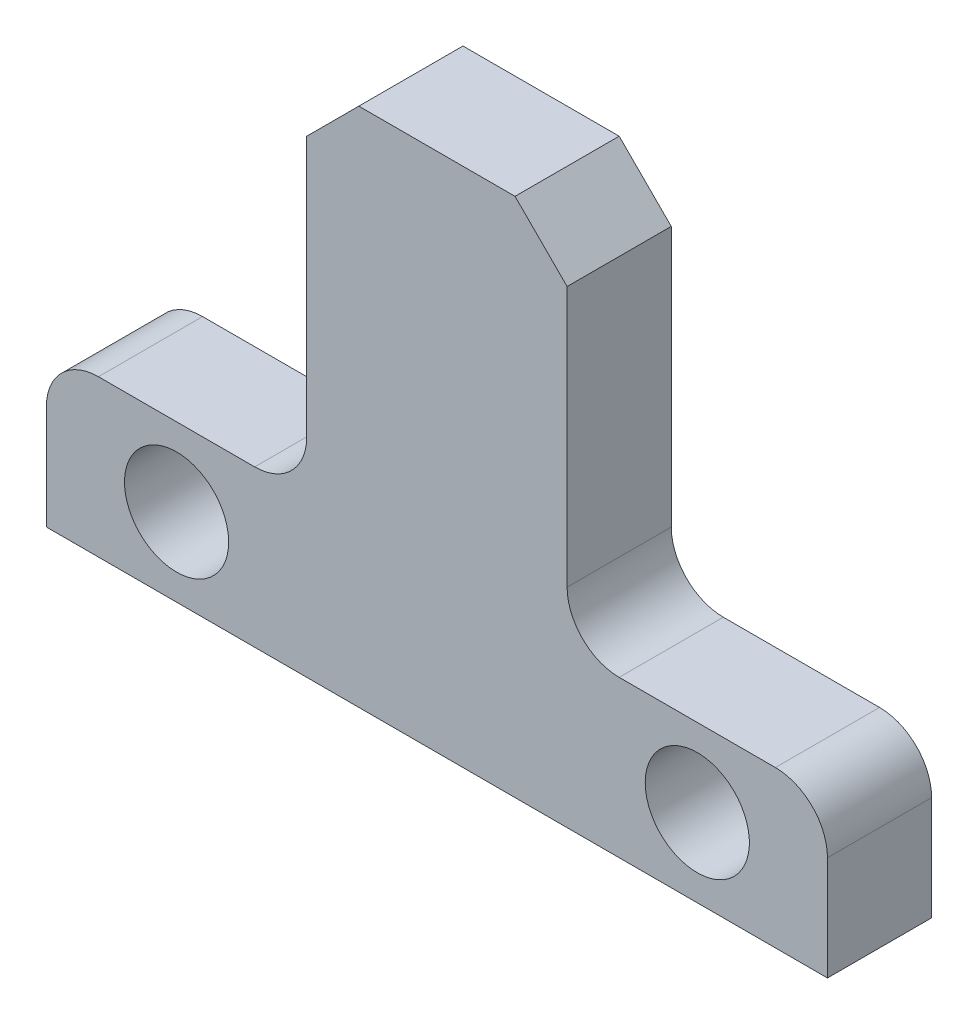
ISO-10303-21;
HEADER;
FILE_DESCRIPTION(('STEP AP214'),'2;1');
FILE_NAME('part.step','',(''),(''),'','','');
FILE_SCHEMA(('AUTOMOTIVE_DESIGN { 1 0 10303 214 1 1 1 1 }'));
ENDSEC;
DATA;
#1=APPLICATION_CONTEXT('core data for automotive mechanical design processes');
#2=APPLICATION_PROTOCOL_DEFINITION('international standard','automotive_design',2000,#1);
#3=PRODUCT_CONTEXT('',#1,'mechanical');
#4=PRODUCT('Part','Part','',(#3));
#5=PRODUCT_RELATED_PRODUCT_CATEGORY('part','',(#4));
#6=PRODUCT_DEFINITION_FORMATION('','',#4);
#7=PRODUCT_DEFINITION_CONTEXT('part definition',#1,'design');
#8=PRODUCT_DEFINITION('design','',#6,#7);
#9=PRODUCT_DEFINITION_SHAPE('','',#8);
#10=(LENGTH_UNIT() NAMED_UNIT(*) SI_UNIT(.MILLI.,.METRE.));
#11=(NAMED_UNIT(*) PLANE_ANGLE_UNIT() SI_UNIT($,.RADIAN.));
#12=(NAMED_UNIT(*) SI_UNIT($,.STERADIAN.) SOLID_ANGLE_UNIT());
#13=UNCERTAINTY_MEASURE_WITH_UNIT(LENGTH_MEASURE(1.E-05),#10,'distance_accuracy_value','');
#14=(GEOMETRIC_REPRESENTATION_CONTEXT(3) GLOBAL_UNCERTAINTY_ASSIGNED_CONTEXT((#13)) GLOBAL_UNIT_ASSIGNED_CONTEXT((#10,
#11,#12)) REPRESENTATION_CONTEXT('',''));
#15=CARTESIAN_POINT('',(0.,0.,0.));
#16=DIRECTION('',(0.,0.,1.));
#17=DIRECTION('',(1.,0.,0.));
#18=AXIS2_PLACEMENT_3D('',#15,#16,#17);
#19=CARTESIAN_POINT('',(-65.,20.,20.));
#20=DIRECTION('',(0.,0.,1.));
#21=DIRECTION('',(1.,0.,0.));
#22=AXIS2_PLACEMENT_3D('',#19,#20,#21);
#23=PLANE('',#22);
#24=CARTESIAN_POINT('',(50.,15.,20.));
#25=DIRECTION('',(0.,0.,1.));
#26=DIRECTION('',(-1.,0.,0.));
#27=AXIS2_PLACEMENT_3D('',#24,#25,#26);
#28=CIRCLE('',#27,10.);
#29=CARTESIAN_POINT('',(40.,15.,20.));
#30=VERTEX_POINT('',#29);
#31=EDGE_CURVE('E186',#30,#30,#28,.T.);
#32=ORIENTED_EDGE('',*,*,#31,.F.);
#33=EDGE_LOOP('',(#32));
#34=FACE_BOUND('',#33,.T.);
#35=DIRECTION('',(0.,-1.,0.));
#36=VECTOR('',#35,1.);
#37=CARTESIAN_POINT('',(-75.,0.,20.));
#38=LINE('',#37,#36);
#39=CARTESIAN_POINT('',(-75.,19.9999999999999,20.));
#40=VERTEX_POINT('',#39);
#41=CARTESIAN_POINT('',(-75.,0.,20.));
#42=VERTEX_POINT('',#41);
#43=EDGE_CURVE('E222',#40,#42,#38,.T.);
#44=ORIENTED_EDGE('',*,*,#43,.T.);
#45=DIRECTION('',(1.,0.,0.));
#46=VECTOR('',#45,1.);
#47=CARTESIAN_POINT('',(-75.,0.,20.));
#48=LINE('',#47,#46);
#49=CARTESIAN_POINT('',(75.,0.,20.));
#50=VERTEX_POINT('',#49);
#51=EDGE_CURVE('E122',#42,#50,#48,.T.);
#52=ORIENTED_EDGE('',*,*,#51,.T.);
#53=DIRECTION('',(0.,1.,0.));
#54=VECTOR('',#53,1.);
#55=CARTESIAN_POINT('',(75.,0.,20.));
#56=LINE('',#55,#54);
#57=CARTESIAN_POINT('',(75.,19.9999999999999,20.));
#58=VERTEX_POINT('',#57);
#59=EDGE_CURVE('E267',#50,#58,#56,.T.);
#60=ORIENTED_EDGE('',*,*,#59,.T.);
#61=CARTESIAN_POINT('',(65.,20.,20.));
#62=DIRECTION('',(0.,0.,1.));
#63=DIRECTION('',(-1.,0.,0.));
#64=AXIS2_PLACEMENT_3D('',#61,#62,#63);
#65=CIRCLE('',#64,10.);
#66=CARTESIAN_POINT('',(64.9999999999999,30.,20.));
#67=VERTEX_POINT('',#66);
#68=EDGE_CURVE('E287',#58,#67,#65,.T.);
#69=ORIENTED_EDGE('',*,*,#68,.T.);
#70=DIRECTION('',(-1.,0.,0.));
#71=VECTOR('',#70,1.);
#72=CARTESIAN_POINT('',(64.9999999999999,30.,20.));
#73=LINE('',#72,#71);
#74=CARTESIAN_POINT('',(35.,30.,20.));
#75=VERTEX_POINT('',#74);
#76=EDGE_CURVE('E283',#67,#75,#73,.T.);
#77=ORIENTED_EDGE('',*,*,#76,.T.);
#78=CARTESIAN_POINT('',(35.,40.,20.));
#79=DIRECTION('',(0.,0.,-1.));
#80=DIRECTION('',(1.,0.,0.));
#81=AXIS2_PLACEMENT_3D('',#78,#79,#80);
#82=CIRCLE('',#81,9.99999999999999);
#83=CARTESIAN_POINT('',(25.,40.0000000000001,20.));
#84=VERTEX_POINT('',#83);
#85=EDGE_CURVE('E286',#75,#84,#82,.T.);
#86=ORIENTED_EDGE('',*,*,#85,.T.);
#87=DIRECTION('',(0.,1.,0.));
#88=VECTOR('',#87,1.);
#89=CARTESIAN_POINT('',(25.,40.0000000000001,20.));
#90=LINE('',#89,#88);
#91=CARTESIAN_POINT('',(25.,90.,20.));
#92=VERTEX_POINT('',#91);
#93=EDGE_CURVE('E291',#84,#92,#90,.T.);
#94=ORIENTED_EDGE('',*,*,#93,.T.);
#95=DIRECTION('',(-0.707106781186548,0.707106781186547,0.));
#96=VECTOR('',#95,1.);
#97=CARTESIAN_POINT('',(25.,90.,20.));
#98=LINE('',#97,#96);
#99=CARTESIAN_POINT('',(15.,100.,20.));
#100=VERTEX_POINT('',#99);
#101=EDGE_CURVE('E298',#92,#100,#98,.T.);
#102=ORIENTED_EDGE('',*,*,#101,.T.);
#103=DIRECTION('',(-1.,0.,0.));
#104=VECTOR('',#103,1.);
#105=CARTESIAN_POINT('',(-15.,100.,20.));
#106=LINE('',#105,#104);
#107=CARTESIAN_POINT('',(-15.,100.,20.));
#108=VERTEX_POINT('',#107);
#109=EDGE_CURVE('E301',#100,#108,#106,.T.);
#110=ORIENTED_EDGE('',*,*,#109,.T.);
#111=DIRECTION('',(-0.707106781186548,-0.707106781186547,0.));
#112=VECTOR('',#111,1.);
#113=CARTESIAN_POINT('',(-25.,90.,20.));
#114=LINE('',#113,#112);
#115=CARTESIAN_POINT('',(-25.,90.,20.));
#116=VERTEX_POINT('',#115);
#117=EDGE_CURVE('E304',#108,#116,#114,.T.);
#118=ORIENTED_EDGE('',*,*,#117,.T.);
#119=DIRECTION('',(0.,-1.,0.));
#120=VECTOR('',#119,1.);
#121=CARTESIAN_POINT('',(-25.,40.0000000000001,20.));
#122=LINE('',#121,#120);
#123=CARTESIAN_POINT('',(-25.,40.0000000000001,20.));
#124=VERTEX_POINT('',#123);
#125=EDGE_CURVE('E159',#116,#124,#122,.T.);
#126=ORIENTED_EDGE('',*,*,#125,.T.);
#127=CARTESIAN_POINT('',(-35.,40.,20.));
#128=DIRECTION('',(0.,0.,-1.));
#129=DIRECTION('',(-1.,0.,0.));
#130=AXIS2_PLACEMENT_3D('',#127,#128,#129);
#131=CIRCLE('',#130,9.99999999999999);
#132=CARTESIAN_POINT('',(-35.,30.,20.));
#133=VERTEX_POINT('',#132);
#134=EDGE_CURVE('E153',#124,#133,#131,.T.);
#135=ORIENTED_EDGE('',*,*,#134,.T.);
#136=DIRECTION('',(-1.,0.,0.));
#137=VECTOR('',#136,1.);
#138=CARTESIAN_POINT('',(-64.9999999999999,30.,20.));
#139=LINE('',#138,#137);
#140=CARTESIAN_POINT('',(-64.9999999999999,30.,20.));
#141=VERTEX_POINT('',#140);
#142=EDGE_CURVE('E157',#133,#141,#139,.T.);
#143=ORIENTED_EDGE('',*,*,#142,.T.);
#144=CARTESIAN_POINT('',(-65.,20.,20.));
#145=DIRECTION('',(0.,0.,1.));
#146=DIRECTION('',(1.,0.,0.));
#147=AXIS2_PLACEMENT_3D('',#144,#145,#146);
#148=CIRCLE('',#147,10.);
#149=EDGE_CURVE('E61',#141,#40,#148,.T.);
#150=ORIENTED_EDGE('',*,*,#149,.T.);
#151=EDGE_LOOP('',(#44,#52,#60,#69,#77,#86,#94,#102,#110,#118,#126,#135,#143,#150));
#152=FACE_BOUND('',#151,.T.);
#153=CARTESIAN_POINT('',(-50.,15.,20.));
#154=DIRECTION('',(0.,0.,1.));
#155=DIRECTION('',(1.,0.,0.));
#156=AXIS2_PLACEMENT_3D('',#153,#154,#155);
#157=CIRCLE('',#156,10.);
#158=CARTESIAN_POINT('',(-40.,15.,20.));
#159=VERTEX_POINT('',#158);
#160=EDGE_CURVE('E348',#159,#159,#157,.T.);
#161=ORIENTED_EDGE('',*,*,#160,.F.);
#162=EDGE_LOOP('',(#161));
#163=FACE_BOUND('',#162,.T.);
#164=ADVANCED_FACE('F43',(#34,#152,#163),#23,.T.);
#165=CARTESIAN_POINT('',(-65.,20.,0.));
#166=DIRECTION('',(0.,0.,1.));
#167=DIRECTION('',(1.,0.,0.));
#168=AXIS2_PLACEMENT_3D('',#165,#166,#167);
#169=PLANE('',#168);
#170=DIRECTION('',(0.,-1.,0.));
#171=VECTOR('',#170,1.);
#172=CARTESIAN_POINT('',(-75.,0.,0.));
#173=LINE('',#172,#171);
#174=CARTESIAN_POINT('',(-75.,19.9999999999999,0.));
#175=VERTEX_POINT('',#174);
#176=CARTESIAN_POINT('',(-75.,0.,0.));
#177=VERTEX_POINT('',#176);
#178=EDGE_CURVE('E181',#175,#177,#173,.T.);
#179=ORIENTED_EDGE('',*,*,#178,.F.);
#180=CARTESIAN_POINT('',(-65.,20.,0.));
#181=DIRECTION('',(0.,0.,1.));
#182=DIRECTION('',(1.,0.,0.));
#183=AXIS2_PLACEMENT_3D('',#180,#181,#182);
#184=CIRCLE('',#183,10.);
#185=CARTESIAN_POINT('',(-64.9999999999999,30.,0.));
#186=VERTEX_POINT('',#185);
#187=EDGE_CURVE('E114',#186,#175,#184,.T.);
#188=ORIENTED_EDGE('',*,*,#187,.F.);
#189=DIRECTION('',(-1.,0.,0.));
#190=VECTOR('',#189,1.);
#191=CARTESIAN_POINT('',(-64.9999999999999,30.,0.));
#192=LINE('',#191,#190);
#193=CARTESIAN_POINT('',(-35.,30.,0.));
#194=VERTEX_POINT('',#193);
#195=EDGE_CURVE('E108',#194,#186,#192,.T.);
#196=ORIENTED_EDGE('',*,*,#195,.F.);
#197=CARTESIAN_POINT('',(-35.,40.,0.));
#198=DIRECTION('',(0.,0.,-1.));
#199=DIRECTION('',(-1.,0.,0.));
#200=AXIS2_PLACEMENT_3D('',#197,#198,#199);
#201=CIRCLE('',#200,9.99999999999999);
#202=CARTESIAN_POINT('',(-25.,40.0000000000001,0.));
#203=VERTEX_POINT('',#202);
#204=EDGE_CURVE('E168',#203,#194,#201,.T.);
#205=ORIENTED_EDGE('',*,*,#204,.F.);
#206=DIRECTION('',(0.,-1.,0.));
#207=VECTOR('',#206,1.);
#208=CARTESIAN_POINT('',(-25.,40.0000000000001,0.));
#209=LINE('',#208,#207);
#210=CARTESIAN_POINT('',(-25.,90.,0.));
#211=VERTEX_POINT('',#210);
#212=EDGE_CURVE('E213',#211,#203,#209,.T.);
#213=ORIENTED_EDGE('',*,*,#212,.F.);
#214=DIRECTION('',(-0.707106781186548,-0.707106781186547,0.));
#215=VECTOR('',#214,1.);
#216=CARTESIAN_POINT('',(-25.,90.,0.));
#217=LINE('',#216,#215);
#218=CARTESIAN_POINT('',(-15.,100.,0.));
#219=VERTEX_POINT('',#218);
#220=EDGE_CURVE('E210',#219,#211,#217,.T.);
#221=ORIENTED_EDGE('',*,*,#220,.F.);
#222=DIRECTION('',(-1.,0.,0.));
#223=VECTOR('',#222,1.);
#224=CARTESIAN_POINT('',(-15.,100.,0.));
#225=LINE('',#224,#223);
#226=CARTESIAN_POINT('',(15.,100.,0.));
#227=VERTEX_POINT('',#226);
#228=EDGE_CURVE('E207',#227,#219,#225,.T.);
#229=ORIENTED_EDGE('',*,*,#228,.F.);
#230=DIRECTION('',(-0.707106781186548,0.707106781186547,0.));
#231=VECTOR('',#230,1.);
#232=CARTESIAN_POINT('',(25.,90.,0.));
#233=LINE('',#232,#231);
#234=CARTESIAN_POINT('',(25.,90.,0.));
#235=VERTEX_POINT('',#234);
#236=EDGE_CURVE('E204',#235,#227,#233,.T.);
#237=ORIENTED_EDGE('',*,*,#236,.F.);
#238=DIRECTION('',(0.,1.,0.));
#239=VECTOR('',#238,1.);
#240=CARTESIAN_POINT('',(25.,40.0000000000001,0.));
#241=LINE('',#240,#239);
#242=CARTESIAN_POINT('',(25.,40.0000000000001,0.));
#243=VERTEX_POINT('',#242);
#244=EDGE_CURVE('E201',#243,#235,#241,.T.);
#245=ORIENTED_EDGE('',*,*,#244,.F.);
#246=CARTESIAN_POINT('',(35.,40.,0.));
#247=DIRECTION('',(0.,0.,-1.));
#248=DIRECTION('',(1.,0.,0.));
#249=AXIS2_PLACEMENT_3D('',#246,#247,#248);
#250=CIRCLE('',#249,9.99999999999999);
#251=CARTESIAN_POINT('',(35.,30.,0.));
#252=VERTEX_POINT('',#251);
#253=EDGE_CURVE('E198',#252,#243,#250,.T.);
#254=ORIENTED_EDGE('',*,*,#253,.F.);
#255=DIRECTION('',(-1.,0.,0.));
#256=VECTOR('',#255,1.);
#257=CARTESIAN_POINT('',(64.9999999999999,30.,0.));
#258=LINE('',#257,#256);
#259=CARTESIAN_POINT('',(64.9999999999999,30.,0.));
#260=VERTEX_POINT('',#259);
#261=EDGE_CURVE('E195',#260,#252,#258,.T.);
#262=ORIENTED_EDGE('',*,*,#261,.F.);
#263=CARTESIAN_POINT('',(65.,20.,0.));
#264=DIRECTION('',(0.,0.,1.));
#265=DIRECTION('',(-1.,0.,0.));
#266=AXIS2_PLACEMENT_3D('',#263,#264,#265);
#267=CIRCLE('',#266,10.);
#268=CARTESIAN_POINT('',(75.,19.9999999999999,0.));
#269=VERTEX_POINT('',#268);
#270=EDGE_CURVE('E192',#269,#260,#267,.T.);
#271=ORIENTED_EDGE('',*,*,#270,.F.);
#272=DIRECTION('',(0.,1.,0.));
#273=VECTOR('',#272,1.);
#274=CARTESIAN_POINT('',(75.,0.,0.));
#275=LINE('',#274,#273);
#276=CARTESIAN_POINT('',(75.,0.,0.));
#277=VERTEX_POINT('',#276);
#278=EDGE_CURVE('E189',#277,#269,#275,.T.);
#279=ORIENTED_EDGE('',*,*,#278,.F.);
#280=DIRECTION('',(1.,0.,0.));
#281=VECTOR('',#280,1.);
#282=CARTESIAN_POINT('',(-75.,0.,0.));
#283=LINE('',#282,#281);
#284=EDGE_CURVE('E185',#177,#277,#283,.T.);
#285=ORIENTED_EDGE('',*,*,#284,.F.);
#286=EDGE_LOOP('',(#179,#188,#196,#205,#213,#221,#229,#237,#245,#254,#262,#271,#279,#285));
#287=FACE_BOUND('',#286,.T.);
#288=CARTESIAN_POINT('',(50.,15.,0.));
#289=DIRECTION('',(0.,0.,1.));
#290=DIRECTION('',(-1.,0.,0.));
#291=AXIS2_PLACEMENT_3D('',#288,#289,#290);
#292=CIRCLE('',#291,10.);
#293=CARTESIAN_POINT('',(40.,15.,0.));
#294=VERTEX_POINT('',#293);
#295=EDGE_CURVE('E356',#294,#294,#292,.T.);
#296=ORIENTED_EDGE('',*,*,#295,.T.);
#297=EDGE_LOOP('',(#296));
#298=FACE_BOUND('',#297,.T.);
#299=CARTESIAN_POINT('',(-50.,15.,0.));
#300=DIRECTION('',(0.,0.,1.));
#301=DIRECTION('',(1.,0.,0.));
#302=AXIS2_PLACEMENT_3D('',#299,#300,#301);
#303=CIRCLE('',#302,10.);
#304=CARTESIAN_POINT('',(-40.,15.,0.));
#305=VERTEX_POINT('',#304);
#306=EDGE_CURVE('E351',#305,#305,#303,.T.);
#307=ORIENTED_EDGE('',*,*,#306,.T.);
#308=EDGE_LOOP('',(#307));
#309=FACE_BOUND('',#308,.T.);
#310=ADVANCED_FACE('F271',(#287,#298,#309),#169,.F.);
#311=CARTESIAN_POINT('',(-75.,0.,20.));
#312=DIRECTION('',(1.,0.,0.));
#313=DIRECTION('',(0.,0.,-1.));
#314=AXIS2_PLACEMENT_3D('',#311,#312,#313);
#315=PLANE('',#314);
#316=ORIENTED_EDGE('',*,*,#178,.T.);
#317=DIRECTION('',(0.,0.,-1.));
#318=VECTOR('',#317,1.);
#319=CARTESIAN_POINT('',(-75.,0.,20.));
#320=LINE('',#319,#318);
#321=EDGE_CURVE('E11',#42,#177,#320,.T.);
#322=ORIENTED_EDGE('',*,*,#321,.F.);
#323=ORIENTED_EDGE('',*,*,#43,.F.);
#324=DIRECTION('',(0.,0.,-1.));
#325=VECTOR('',#324,1.);
#326=CARTESIAN_POINT('',(-75.,19.9999999999999,20.));
#327=LINE('',#326,#325);
#328=EDGE_CURVE('E177',#40,#175,#327,.T.);
#329=ORIENTED_EDGE('',*,*,#328,.T.);
#330=EDGE_LOOP('',(#316,#322,#323,#329));
#331=FACE_BOUND('',#330,.T.);
#332=ADVANCED_FACE('F45',(#331),#315,.F.);
#333=CARTESIAN_POINT('',(-75.,0.,20.));
#334=DIRECTION('',(0.,1.,0.));
#335=DIRECTION('',(0.,0.,1.));
#336=AXIS2_PLACEMENT_3D('',#333,#334,#335);
#337=PLANE('',#336);
#338=ORIENTED_EDGE('',*,*,#284,.T.);
#339=DIRECTION('',(0.,0.,-1.));
#340=VECTOR('',#339,1.);
#341=CARTESIAN_POINT('',(75.,0.,20.));
#342=LINE('',#341,#340);
#343=EDGE_CURVE('E53',#50,#277,#342,.T.);
#344=ORIENTED_EDGE('',*,*,#343,.F.);
#345=ORIENTED_EDGE('',*,*,#51,.F.);
#346=ORIENTED_EDGE('',*,*,#321,.T.);
#347=EDGE_LOOP('',(#338,#344,#345,#346));
#348=FACE_BOUND('',#347,.T.);
#349=ADVANCED_FACE('F486',(#348),#337,.F.);
#350=CARTESIAN_POINT('',(75.,0.,20.));
#351=DIRECTION('',(-1.,0.,0.));
#352=DIRECTION('',(0.,0.,1.));
#353=AXIS2_PLACEMENT_3D('',#350,#351,#352);
#354=PLANE('',#353);
#355=ORIENTED_EDGE('',*,*,#278,.T.);
#356=DIRECTION('',(0.,0.,-1.));
#357=VECTOR('',#356,1.);
#358=CARTESIAN_POINT('',(75.,19.9999999999999,20.));
#359=LINE('',#358,#357);
#360=EDGE_CURVE('E257',#58,#269,#359,.T.);
#361=ORIENTED_EDGE('',*,*,#360,.F.);
#362=ORIENTED_EDGE('',*,*,#59,.F.);
#363=ORIENTED_EDGE('',*,*,#343,.T.);
#364=EDGE_LOOP('',(#355,#361,#362,#363));
#365=FACE_BOUND('',#364,.T.);
#366=ADVANCED_FACE('F265',(#365),#354,.F.);
#367=CARTESIAN_POINT('',(65.,20.,20.));
#368=DIRECTION('',(0.,0.,-1.));
#369=DIRECTION('',(-1.,0.,0.));
#370=AXIS2_PLACEMENT_3D('',#367,#368,#369);
#371=CYLINDRICAL_SURFACE('',#370,10.);
#372=ORIENTED_EDGE('',*,*,#270,.T.);
#373=DIRECTION('',(0.,0.,-1.));
#374=VECTOR('',#373,1.);
#375=CARTESIAN_POINT('',(64.9999999999999,30.,20.));
#376=LINE('',#375,#374);
#377=EDGE_CURVE('E253',#67,#260,#376,.T.);
#378=ORIENTED_EDGE('',*,*,#377,.F.);
#379=ORIENTED_EDGE('',*,*,#68,.F.);
#380=ORIENTED_EDGE('',*,*,#360,.T.);
#381=EDGE_LOOP('',(#372,#378,#379,#380));
#382=FACE_BOUND('',#381,.T.);
#383=ADVANCED_FACE('F277',(#382),#371,.T.);
#384=CARTESIAN_POINT('',(64.9999999999999,30.,20.));
#385=DIRECTION('',(0.,-1.,0.));
#386=DIRECTION('',(0.,0.,-1.));
#387=AXIS2_PLACEMENT_3D('',#384,#385,#386);
#388=PLANE('',#387);
#389=ORIENTED_EDGE('',*,*,#261,.T.);
#390=DIRECTION('',(0.,0.,-1.));
#391=VECTOR('',#390,1.);
#392=CARTESIAN_POINT('',(35.,30.,20.));
#393=LINE('',#392,#391);
#394=EDGE_CURVE('E249',#75,#252,#393,.T.);
#395=ORIENTED_EDGE('',*,*,#394,.F.);
#396=ORIENTED_EDGE('',*,*,#76,.F.);
#397=ORIENTED_EDGE('',*,*,#377,.T.);
#398=EDGE_LOOP('',(#389,#395,#396,#397));
#399=FACE_BOUND('',#398,.T.);
#400=ADVANCED_FACE('F281',(#399),#388,.F.);
#401=CARTESIAN_POINT('',(35.,40.,20.));
#402=DIRECTION('',(0.,0.,-1.));
#403=DIRECTION('',(-1.,0.,0.));
#404=AXIS2_PLACEMENT_3D('',#401,#402,#403);
#405=CYLINDRICAL_SURFACE('',#404,9.99999999999999);
#406=ORIENTED_EDGE('',*,*,#253,.T.);
#407=DIRECTION('',(0.,0.,-1.));
#408=VECTOR('',#407,1.);
#409=CARTESIAN_POINT('',(25.,40.0000000000001,20.));
#410=LINE('',#409,#408);
#411=EDGE_CURVE('E245',#84,#243,#410,.T.);
#412=ORIENTED_EDGE('',*,*,#411,.F.);
#413=ORIENTED_EDGE('',*,*,#85,.F.);
#414=ORIENTED_EDGE('',*,*,#394,.T.);
#415=EDGE_LOOP('',(#406,#412,#413,#414));
#416=FACE_BOUND('',#415,.T.);
#417=ADVANCED_FACE('F447',(#416),#405,.F.);
#418=CARTESIAN_POINT('',(25.,40.0000000000001,20.));
#419=DIRECTION('',(-1.,0.,0.));
#420=DIRECTION('',(0.,0.,1.));
#421=AXIS2_PLACEMENT_3D('',#418,#419,#420);
#422=PLANE('',#421);
#423=ORIENTED_EDGE('',*,*,#244,.T.);
#424=DIRECTION('',(0.,0.,-1.));
#425=VECTOR('',#424,1.);
#426=CARTESIAN_POINT('',(25.,90.,20.));
#427=LINE('',#426,#425);
#428=EDGE_CURVE('E241',#92,#235,#427,.T.);
#429=ORIENTED_EDGE('',*,*,#428,.F.);
#430=ORIENTED_EDGE('',*,*,#93,.F.);
#431=ORIENTED_EDGE('',*,*,#411,.T.);
#432=EDGE_LOOP('',(#423,#429,#430,#431));
#433=FACE_BOUND('',#432,.T.);
#434=ADVANCED_FACE('F436',(#433),#422,.F.);
#435=CARTESIAN_POINT('',(25.,90.,20.));
#436=DIRECTION('',(-0.707106781186547,-0.707106781186548,0.));
#437=DIRECTION('',(0.707106781186548,-0.707106781186547,0.));
#438=AXIS2_PLACEMENT_3D('',#435,#436,#437);
#439=PLANE('',#438);
#440=ORIENTED_EDGE('',*,*,#236,.T.);
#441=DIRECTION('',(0.,0.,-1.));
#442=VECTOR('',#441,1.);
#443=CARTESIAN_POINT('',(15.,100.,20.));
#444=LINE('',#443,#442);
#445=EDGE_CURVE('E237',#100,#227,#444,.T.);
#446=ORIENTED_EDGE('',*,*,#445,.F.);
#447=ORIENTED_EDGE('',*,*,#101,.F.);
#448=ORIENTED_EDGE('',*,*,#428,.T.);
#449=EDGE_LOOP('',(#440,#446,#447,#448));
#450=FACE_BOUND('',#449,.T.);
#451=ADVANCED_FACE('F425',(#450),#439,.F.);
#452=CARTESIAN_POINT('',(-15.,100.,20.));
#453=DIRECTION('',(0.,-1.,0.));
#454=DIRECTION('',(0.,0.,-1.));
#455=AXIS2_PLACEMENT_3D('',#452,#453,#454);
#456=PLANE('',#455);
#457=ORIENTED_EDGE('',*,*,#228,.T.);
#458=DIRECTION('',(0.,0.,-1.));
#459=VECTOR('',#458,1.);
#460=CARTESIAN_POINT('',(-15.,100.,20.));
#461=LINE('',#460,#459);
#462=EDGE_CURVE('E233',#108,#219,#461,.T.);
#463=ORIENTED_EDGE('',*,*,#462,.F.);
#464=ORIENTED_EDGE('',*,*,#109,.F.);
#465=ORIENTED_EDGE('',*,*,#445,.T.);
#466=EDGE_LOOP('',(#457,#463,#464,#465));
#467=FACE_BOUND('',#466,.T.);
#468=ADVANCED_FACE('F415',(#467),#456,.F.);
#469=CARTESIAN_POINT('',(-25.,90.,20.));
#470=DIRECTION('',(0.707106781186547,-0.707106781186548,0.));
#471=DIRECTION('',(0.707106781186548,0.707106781186547,0.));
#472=AXIS2_PLACEMENT_3D('',#469,#470,#471);
#473=PLANE('',#472);
#474=ORIENTED_EDGE('',*,*,#220,.T.);
#475=DIRECTION('',(0.,0.,-1.));
#476=VECTOR('',#475,1.);
#477=CARTESIAN_POINT('',(-25.,90.,20.));
#478=LINE('',#477,#476);
#479=EDGE_CURVE('E229',#116,#211,#478,.T.);
#480=ORIENTED_EDGE('',*,*,#479,.F.);
#481=ORIENTED_EDGE('',*,*,#117,.F.);
#482=ORIENTED_EDGE('',*,*,#462,.T.);
#483=EDGE_LOOP('',(#474,#480,#481,#482));
#484=FACE_BOUND('',#483,.T.);
#485=ADVANCED_FACE('F312',(#484),#473,.F.);
#486=CARTESIAN_POINT('',(-25.,40.0000000000001,20.));
#487=DIRECTION('',(1.,0.,0.));
#488=DIRECTION('',(0.,0.,-1.));
#489=AXIS2_PLACEMENT_3D('',#486,#487,#488);
#490=PLANE('',#489);
#491=ORIENTED_EDGE('',*,*,#212,.T.);
#492=DIRECTION('',(0.,0.,-1.));
#493=VECTOR('',#492,1.);
#494=CARTESIAN_POINT('',(-25.,40.0000000000001,20.));
#495=LINE('',#494,#493);
#496=EDGE_CURVE('E170',#124,#203,#495,.T.);
#497=ORIENTED_EDGE('',*,*,#496,.F.);
#498=ORIENTED_EDGE('',*,*,#125,.F.);
#499=ORIENTED_EDGE('',*,*,#479,.T.);
#500=EDGE_LOOP('',(#491,#497,#498,#499));
#501=FACE_BOUND('',#500,.T.);
#502=ADVANCED_FACE('F316',(#501),#490,.F.);
#503=CARTESIAN_POINT('',(-35.,40.,20.));
#504=DIRECTION('',(0.,0.,-1.));
#505=DIRECTION('',(-1.,0.,0.));
#506=AXIS2_PLACEMENT_3D('',#503,#504,#505);
#507=CYLINDRICAL_SURFACE('',#506,9.99999999999999);
#508=ORIENTED_EDGE('',*,*,#204,.T.);
#509=DIRECTION('',(0.,0.,-1.));
#510=VECTOR('',#509,1.);
#511=CARTESIAN_POINT('',(-35.,30.,20.));
#512=LINE('',#511,#510);
#513=EDGE_CURVE('E165',#133,#194,#512,.T.);
#514=ORIENTED_EDGE('',*,*,#513,.F.);
#515=ORIENTED_EDGE('',*,*,#134,.F.);
#516=ORIENTED_EDGE('',*,*,#496,.T.);
#517=EDGE_LOOP('',(#508,#514,#515,#516));
#518=FACE_BOUND('',#517,.T.);
#519=ADVANCED_FACE('F166',(#518),#507,.F.);
#520=CARTESIAN_POINT('',(-64.9999999999999,30.,20.));
#521=DIRECTION('',(0.,-1.,0.));
#522=DIRECTION('',(0.,0.,-1.));
#523=AXIS2_PLACEMENT_3D('',#520,#521,#522);
#524=PLANE('',#523);
#525=ORIENTED_EDGE('',*,*,#195,.T.);
#526=DIRECTION('',(0.,0.,-1.));
#527=VECTOR('',#526,1.);
#528=CARTESIAN_POINT('',(-64.9999999999999,30.,20.));
#529=LINE('',#528,#527);
#530=EDGE_CURVE('E171',#141,#186,#529,.T.);
#531=ORIENTED_EDGE('',*,*,#530,.F.);
#532=ORIENTED_EDGE('',*,*,#142,.F.);
#533=ORIENTED_EDGE('',*,*,#513,.T.);
#534=EDGE_LOOP('',(#525,#531,#532,#533));
#535=FACE_BOUND('',#534,.T.);
#536=ADVANCED_FACE('F173',(#535),#524,.F.);
#537=CARTESIAN_POINT('',(-65.,20.,20.));
#538=DIRECTION('',(0.,0.,-1.));
#539=DIRECTION('',(-1.,0.,0.));
#540=AXIS2_PLACEMENT_3D('',#537,#538,#539);
#541=CYLINDRICAL_SURFACE('',#540,10.);
#542=ORIENTED_EDGE('',*,*,#187,.T.);
#543=ORIENTED_EDGE('',*,*,#328,.F.);
#544=ORIENTED_EDGE('',*,*,#149,.F.);
#545=ORIENTED_EDGE('',*,*,#530,.T.);
#546=EDGE_LOOP('',(#542,#543,#544,#545));
#547=FACE_BOUND('',#546,.T.);
#548=ADVANCED_FACE('F320',(#547),#541,.T.);
#549=CARTESIAN_POINT('',(50.,15.,20.));
#550=DIRECTION('',(0.,0.,-1.));
#551=DIRECTION('',(-1.,0.,0.));
#552=AXIS2_PLACEMENT_3D('',#549,#550,#551);
#553=CYLINDRICAL_SURFACE('',#552,10.);
#554=ORIENTED_EDGE('',*,*,#31,.T.);
#555=EDGE_LOOP('',(#554));
#556=FACE_BOUND('',#555,.T.);
#557=ORIENTED_EDGE('',*,*,#295,.F.);
#558=EDGE_LOOP('',(#557));
#559=FACE_BOUND('',#558,.T.);
#560=ADVANCED_FACE('F322',(#556,#559),#553,.F.);
#561=CARTESIAN_POINT('',(-50.,15.,20.));
#562=DIRECTION('',(0.,0.,-1.));
#563=DIRECTION('',(-1.,0.,0.));
#564=AXIS2_PLACEMENT_3D('',#561,#562,#563);
#565=CYLINDRICAL_SURFACE('',#564,10.);
#566=ORIENTED_EDGE('',*,*,#160,.T.);
#567=EDGE_LOOP('',(#566));
#568=FACE_BOUND('',#567,.T.);
#569=ORIENTED_EDGE('',*,*,#306,.F.);
#570=EDGE_LOOP('',(#569));
#571=FACE_BOUND('',#570,.T.);
#572=ADVANCED_FACE('F328',(#568,#571),#565,.F.);
#573=CLOSED_SHELL('',(#164,#310,#332,#349,#366,#383,#400,#417,#434,#451,#468,#485,#502,#519,
#536,#548,#560,#572));
#574=MANIFOLD_SOLID_BREP('B2',#573);
#575=ADVANCED_BREP_SHAPE_REPRESENTATION('',(#18,#574),#14);
#576=SHAPE_DEFINITION_REPRESENTATION(#9,#575);
ENDSEC;
END-ISO-10303-21;
